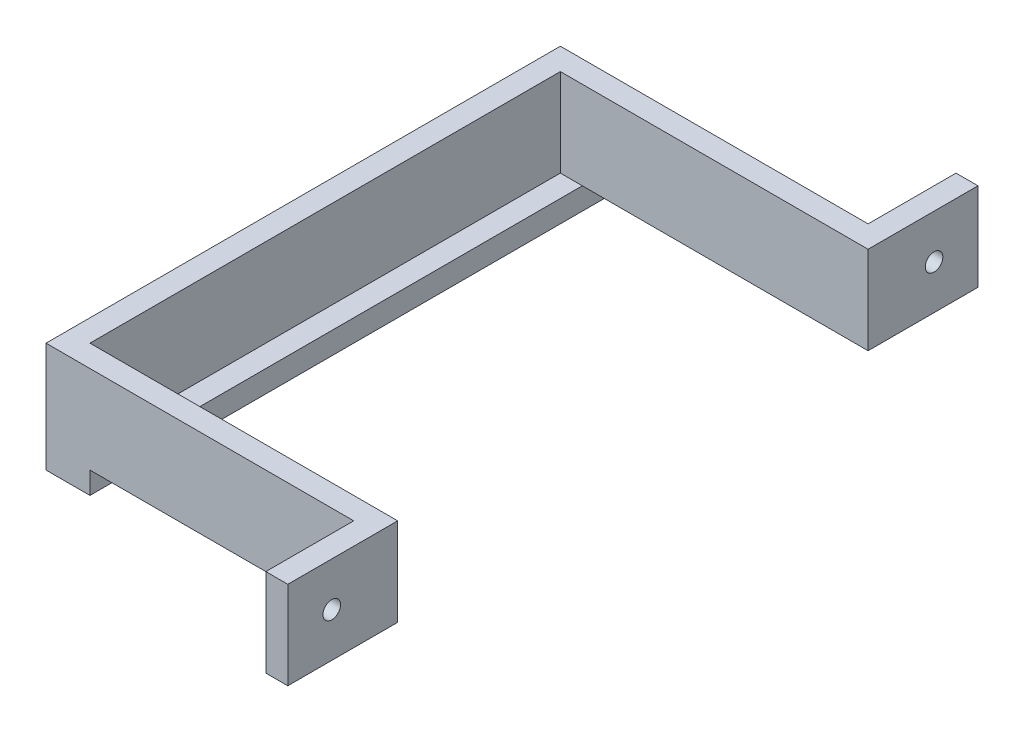
ISO-10303-21;
HEADER;
FILE_DESCRIPTION(('STEP AP214'),'2;1');
FILE_NAME('part.step','',(''),(''),'','','');
FILE_SCHEMA(('AUTOMOTIVE_DESIGN { 1 0 10303 214 1 1 1 1 }'));
ENDSEC;
DATA;
#1=APPLICATION_CONTEXT('core data for automotive mechanical design processes');
#2=APPLICATION_PROTOCOL_DEFINITION('international standard','automotive_design',2000,#1);
#3=PRODUCT_CONTEXT('',#1,'mechanical');
#4=PRODUCT('Part','Part','',(#3));
#5=PRODUCT_RELATED_PRODUCT_CATEGORY('part','',(#4));
#6=PRODUCT_DEFINITION_FORMATION('','',#4);
#7=PRODUCT_DEFINITION_CONTEXT('part definition',#1,'design');
#8=PRODUCT_DEFINITION('design','',#6,#7);
#9=PRODUCT_DEFINITION_SHAPE('','',#8);
#10=(LENGTH_UNIT() NAMED_UNIT(*) SI_UNIT(.MILLI.,.METRE.));
#11=(NAMED_UNIT(*) PLANE_ANGLE_UNIT() SI_UNIT($,.RADIAN.));
#12=(NAMED_UNIT(*) SI_UNIT($,.STERADIAN.) SOLID_ANGLE_UNIT());
#13=UNCERTAINTY_MEASURE_WITH_UNIT(LENGTH_MEASURE(1.E-05),#10,'distance_accuracy_value','');
#14=(GEOMETRIC_REPRESENTATION_CONTEXT(3) GLOBAL_UNCERTAINTY_ASSIGNED_CONTEXT((#13)) GLOBAL_UNIT_ASSIGNED_CONTEXT((#10,
#11,#12)) REPRESENTATION_CONTEXT('',''));
#15=CARTESIAN_POINT('',(0.,0.,0.));
#16=DIRECTION('',(0.,0.,1.));
#17=DIRECTION('',(1.,0.,0.));
#18=AXIS2_PLACEMENT_3D('',#15,#16,#17);
#19=CARTESIAN_POINT('',(5.,10.,-58.5));
#20=DIRECTION('',(0.,0.,1.));
#21=DIRECTION('',(1.,0.,0.));
#22=AXIS2_PLACEMENT_3D('',#19,#20,#21);
#23=PLANE('',#22);
#24=DIRECTION('',(0.,1.,0.));
#25=VECTOR('',#24,1.);
#26=CARTESIAN_POINT('',(70.,10.,-58.5));
#27=LINE('',#26,#25);
#28=CARTESIAN_POINT('',(70.,-10.,-58.5));
#29=VERTEX_POINT('',#28);
#30=CARTESIAN_POINT('',(70.,10.,-58.5));
#31=VERTEX_POINT('',#30);
#32=EDGE_CURVE('E58',#29,#31,#27,.T.);
#33=ORIENTED_EDGE('',*,*,#32,.F.);
#34=DIRECTION('',(-1.,0.,0.));
#35=VECTOR('',#34,1.);
#36=CARTESIAN_POINT('',(5.,-10.,-58.5));
#37=LINE('',#36,#35);
#38=CARTESIAN_POINT('',(10.,-10.,-58.5));
#39=VERTEX_POINT('',#38);
#40=EDGE_CURVE('E256',#29,#39,#37,.T.);
#41=ORIENTED_EDGE('',*,*,#40,.T.);
#42=DIRECTION('',(0.,1.,0.));
#43=VECTOR('',#42,1.);
#44=CARTESIAN_POINT('',(10.,-15.,-58.5));
#45=LINE('',#44,#43);
#46=CARTESIAN_POINT('',(10.,-15.,-58.5));
#47=VERTEX_POINT('',#46);
#48=EDGE_CURVE('E220',#47,#39,#45,.T.);
#49=ORIENTED_EDGE('',*,*,#48,.F.);
#50=DIRECTION('',(1.,0.,0.));
#51=VECTOR('',#50,1.);
#52=CARTESIAN_POINT('',(0.,-15.,-58.5));
#53=LINE('',#52,#51);
#54=CARTESIAN_POINT('',(0.,-15.,-58.5));
#55=VERTEX_POINT('',#54);
#56=EDGE_CURVE('E209',#55,#47,#53,.T.);
#57=ORIENTED_EDGE('',*,*,#56,.F.);
#58=DIRECTION('',(0.,1.,0.));
#59=VECTOR('',#58,1.);
#60=CARTESIAN_POINT('',(0.,10.,-58.5));
#61=LINE('',#60,#59);
#62=CARTESIAN_POINT('',(0.,10.,-58.5));
#63=VERTEX_POINT('',#62);
#64=EDGE_CURVE('E250',#55,#63,#61,.T.);
#65=ORIENTED_EDGE('',*,*,#64,.T.);
#66=DIRECTION('',(-1.,0.,0.));
#67=VECTOR('',#66,1.);
#68=CARTESIAN_POINT('',(5.,10.,-58.5));
#69=LINE('',#68,#67);
#70=EDGE_CURVE('E44',#31,#63,#69,.T.);
#71=ORIENTED_EDGE('',*,*,#70,.F.);
#72=EDGE_LOOP('',(#33,#41,#49,#57,#65,#71));
#73=FACE_BOUND('',#72,.T.);
#74=ADVANCED_FACE('F41',(#73),#23,.F.);
#75=CARTESIAN_POINT('',(5.,10.,58.5));
#76=DIRECTION('',(0.,0.,-1.));
#77=DIRECTION('',(-1.,0.,0.));
#78=AXIS2_PLACEMENT_3D('',#75,#76,#77);
#79=PLANE('',#78);
#80=DIRECTION('',(0.,-1.,0.));
#81=VECTOR('',#80,1.);
#82=CARTESIAN_POINT('',(70.,10.,58.5));
#83=LINE('',#82,#81);
#84=CARTESIAN_POINT('',(70.,10.,58.5));
#85=VERTEX_POINT('',#84);
#86=CARTESIAN_POINT('',(70.,-10.,58.5));
#87=VERTEX_POINT('',#86);
#88=EDGE_CURVE('E66',#85,#87,#83,.T.);
#89=ORIENTED_EDGE('',*,*,#88,.F.);
#90=DIRECTION('',(-1.,0.,0.));
#91=VECTOR('',#90,1.);
#92=CARTESIAN_POINT('',(5.,10.,58.5));
#93=LINE('',#92,#91);
#94=CARTESIAN_POINT('',(0.,10.,58.5));
#95=VERTEX_POINT('',#94);
#96=EDGE_CURVE('E265',#85,#95,#93,.T.);
#97=ORIENTED_EDGE('',*,*,#96,.T.);
#98=DIRECTION('',(0.,-1.,0.));
#99=VECTOR('',#98,1.);
#100=CARTESIAN_POINT('',(0.,10.,58.5));
#101=LINE('',#100,#99);
#102=CARTESIAN_POINT('',(0.,-15.,58.5));
#103=VERTEX_POINT('',#102);
#104=EDGE_CURVE('E254',#95,#103,#101,.T.);
#105=ORIENTED_EDGE('',*,*,#104,.T.);
#106=DIRECTION('',(-1.,0.,0.));
#107=VECTOR('',#106,1.);
#108=CARTESIAN_POINT('',(0.,-15.,58.5));
#109=LINE('',#108,#107);
#110=CARTESIAN_POINT('',(10.,-15.,58.5));
#111=VERTEX_POINT('',#110);
#112=EDGE_CURVE('E213',#111,#103,#109,.T.);
#113=ORIENTED_EDGE('',*,*,#112,.F.);
#114=DIRECTION('',(0.,1.,0.));
#115=VECTOR('',#114,1.);
#116=CARTESIAN_POINT('',(10.,-15.,58.5));
#117=LINE('',#116,#115);
#118=CARTESIAN_POINT('',(10.,-10.,58.5));
#119=VERTEX_POINT('',#118);
#120=EDGE_CURVE('E215',#111,#119,#117,.T.);
#121=ORIENTED_EDGE('',*,*,#120,.T.);
#122=DIRECTION('',(-1.,0.,0.));
#123=VECTOR('',#122,1.);
#124=CARTESIAN_POINT('',(5.,-10.,58.5));
#125=LINE('',#124,#123);
#126=EDGE_CURVE('E264',#87,#119,#125,.T.);
#127=ORIENTED_EDGE('',*,*,#126,.F.);
#128=EDGE_LOOP('',(#89,#97,#105,#113,#121,#127));
#129=FACE_BOUND('',#128,.T.);
#130=ADVANCED_FACE('F281',(#129),#79,.F.);
#131=CARTESIAN_POINT('',(5.,-10.,58.5));
#132=DIRECTION('',(0.,1.,0.));
#133=DIRECTION('',(0.,0.,1.));
#134=AXIS2_PLACEMENT_3D('',#131,#132,#133);
#135=PLANE('',#134);
#136=DIRECTION('',(0.,0.,1.));
#137=VECTOR('',#136,1.);
#138=CARTESIAN_POINT('',(10.,-10.,58.5));
#139=LINE('',#138,#137);
#140=CARTESIAN_POINT('',(10.,-10.,-53.5));
#141=VERTEX_POINT('',#140);
#142=EDGE_CURVE('E50',#39,#141,#139,.T.);
#143=ORIENTED_EDGE('',*,*,#142,.F.);
#144=ORIENTED_EDGE('',*,*,#40,.F.);
#145=DIRECTION('',(0.,0.,1.));
#146=VECTOR('',#145,1.);
#147=CARTESIAN_POINT('',(70.,-10.,-78.5));
#148=LINE('',#147,#146);
#149=CARTESIAN_POINT('',(70.,-10.,-78.5));
#150=VERTEX_POINT('',#149);
#151=EDGE_CURVE('E167',#150,#29,#148,.T.);
#152=ORIENTED_EDGE('',*,*,#151,.F.);
#153=DIRECTION('',(-1.,0.,0.));
#154=VECTOR('',#153,1.);
#155=CARTESIAN_POINT('',(75.,-10.,-78.5));
#156=LINE('',#155,#154);
#157=CARTESIAN_POINT('',(75.,-10.,-78.5));
#158=VERTEX_POINT('',#157);
#159=EDGE_CURVE('E163',#158,#150,#156,.T.);
#160=ORIENTED_EDGE('',*,*,#159,.F.);
#161=DIRECTION('',(0.,0.,-1.));
#162=VECTOR('',#161,1.);
#163=CARTESIAN_POINT('',(75.,-10.,-58.5));
#164=LINE('',#163,#162);
#165=CARTESIAN_POINT('',(75.,-10.,-53.5));
#166=VERTEX_POINT('',#165);
#167=EDGE_CURVE('E150',#166,#158,#164,.T.);
#168=ORIENTED_EDGE('',*,*,#167,.F.);
#169=DIRECTION('',(-1.,0.,0.));
#170=VECTOR('',#169,1.);
#171=CARTESIAN_POINT('',(75.,-10.,-53.5));
#172=LINE('',#171,#170);
#173=EDGE_CURVE('E160',#166,#141,#172,.T.);
#174=ORIENTED_EDGE('',*,*,#173,.T.);
#175=EDGE_LOOP('',(#143,#144,#152,#160,#168,#174));
#176=FACE_BOUND('',#175,.T.);
#177=ADVANCED_FACE('F165',(#176),#135,.F.);
#178=CARTESIAN_POINT('',(10.,-10.,53.5));
#179=VERTEX_POINT('',#178);
#180=EDGE_CURVE('E11',#179,#119,#139,.T.);
#181=ORIENTED_EDGE('',*,*,#180,.F.);
#182=DIRECTION('',(-1.,0.,0.));
#183=VECTOR('',#182,1.);
#184=CARTESIAN_POINT('',(75.,-10.,53.5));
#185=LINE('',#184,#183);
#186=CARTESIAN_POINT('',(75.,-10.,53.5));
#187=VERTEX_POINT('',#186);
#188=EDGE_CURVE('E247',#187,#179,#185,.T.);
#189=ORIENTED_EDGE('',*,*,#188,.F.);
#190=DIRECTION('',(0.,0.,-1.));
#191=VECTOR('',#190,1.);
#192=CARTESIAN_POINT('',(75.,-10.,58.5));
#193=LINE('',#192,#191);
#194=CARTESIAN_POINT('',(75.,-10.,78.5));
#195=VERTEX_POINT('',#194);
#196=EDGE_CURVE('E235',#195,#187,#193,.T.);
#197=ORIENTED_EDGE('',*,*,#196,.F.);
#198=DIRECTION('',(1.,0.,0.));
#199=VECTOR('',#198,1.);
#200=CARTESIAN_POINT('',(75.,-10.,78.5));
#201=LINE('',#200,#199);
#202=CARTESIAN_POINT('',(70.,-10.,78.5));
#203=VERTEX_POINT('',#202);
#204=EDGE_CURVE('E196',#203,#195,#201,.T.);
#205=ORIENTED_EDGE('',*,*,#204,.F.);
#206=DIRECTION('',(0.,0.,-1.));
#207=VECTOR('',#206,1.);
#208=CARTESIAN_POINT('',(70.,-10.,78.5));
#209=LINE('',#208,#207);
#210=EDGE_CURVE('E199',#203,#87,#209,.T.);
#211=ORIENTED_EDGE('',*,*,#210,.T.);
#212=ORIENTED_EDGE('',*,*,#126,.T.);
#213=EDGE_LOOP('',(#181,#189,#197,#205,#211,#212));
#214=FACE_BOUND('',#213,.T.);
#215=ADVANCED_FACE('F288',(#214),#135,.F.);
#216=CARTESIAN_POINT('',(5.,0.,0.));
#217=DIRECTION('',(1.,0.,0.));
#218=DIRECTION('',(0.,0.,-1.));
#219=AXIS2_PLACEMENT_3D('',#216,#217,#218);
#220=PLANE('',#219);
#221=DIRECTION('',(0.,0.,-1.));
#222=VECTOR('',#221,1.);
#223=CARTESIAN_POINT('',(5.,-10.,58.5));
#224=LINE('',#223,#222);
#225=CARTESIAN_POINT('',(5.,-10.,53.5));
#226=VERTEX_POINT('',#225);
#227=CARTESIAN_POINT('',(5.,-10.,-53.5));
#228=VERTEX_POINT('',#227);
#229=EDGE_CURVE('E253',#226,#228,#224,.T.);
#230=ORIENTED_EDGE('',*,*,#229,.T.);
#231=DIRECTION('',(0.,-1.,0.));
#232=VECTOR('',#231,1.);
#233=CARTESIAN_POINT('',(5.,10.,-53.5));
#234=LINE('',#233,#232);
#235=CARTESIAN_POINT('',(5.,10.,-53.5));
#236=VERTEX_POINT('',#235);
#237=EDGE_CURVE('E228',#236,#228,#234,.T.);
#238=ORIENTED_EDGE('',*,*,#237,.F.);
#239=DIRECTION('',(0.,0.,1.));
#240=VECTOR('',#239,1.);
#241=CARTESIAN_POINT('',(5.,10.,58.5));
#242=LINE('',#241,#240);
#243=CARTESIAN_POINT('',(5.,10.,53.5));
#244=VERTEX_POINT('',#243);
#245=EDGE_CURVE('E251',#236,#244,#242,.T.);
#246=ORIENTED_EDGE('',*,*,#245,.T.);
#247=DIRECTION('',(0.,1.,0.));
#248=VECTOR('',#247,1.);
#249=CARTESIAN_POINT('',(5.,10.,53.5));
#250=LINE('',#249,#248);
#251=EDGE_CURVE('E230',#226,#244,#250,.T.);
#252=ORIENTED_EDGE('',*,*,#251,.F.);
#253=EDGE_LOOP('',(#230,#238,#246,#252));
#254=FACE_BOUND('',#253,.T.);
#255=ADVANCED_FACE('F300',(#254),#220,.T.);
#256=CARTESIAN_POINT('',(5.,10.,58.5));
#257=DIRECTION('',(0.,-1.,0.));
#258=DIRECTION('',(0.,0.,-1.));
#259=AXIS2_PLACEMENT_3D('',#256,#257,#258);
#260=PLANE('',#259);
#261=DIRECTION('',(0.,0.,1.));
#262=VECTOR('',#261,1.);
#263=CARTESIAN_POINT('',(0.,10.,58.5));
#264=LINE('',#263,#262);
#265=EDGE_CURVE('E259',#63,#95,#264,.T.);
#266=ORIENTED_EDGE('',*,*,#265,.T.);
#267=ORIENTED_EDGE('',*,*,#96,.F.);
#268=DIRECTION('',(0.,0.,-1.));
#269=VECTOR('',#268,1.);
#270=CARTESIAN_POINT('',(70.,10.,78.5));
#271=LINE('',#270,#269);
#272=CARTESIAN_POINT('',(70.,10.,78.5));
#273=VERTEX_POINT('',#272);
#274=EDGE_CURVE('E203',#273,#85,#271,.T.);
#275=ORIENTED_EDGE('',*,*,#274,.F.);
#276=DIRECTION('',(-1.,0.,0.));
#277=VECTOR('',#276,1.);
#278=CARTESIAN_POINT('',(75.,10.,78.5));
#279=LINE('',#278,#277);
#280=CARTESIAN_POINT('',(75.,10.,78.5));
#281=VERTEX_POINT('',#280);
#282=EDGE_CURVE('E192',#281,#273,#279,.T.);
#283=ORIENTED_EDGE('',*,*,#282,.F.);
#284=DIRECTION('',(0.,0.,1.));
#285=VECTOR('',#284,1.);
#286=CARTESIAN_POINT('',(75.,10.,58.5));
#287=LINE('',#286,#285);
#288=CARTESIAN_POINT('',(75.,10.,53.5));
#289=VERTEX_POINT('',#288);
#290=EDGE_CURVE('E239',#289,#281,#287,.T.);
#291=ORIENTED_EDGE('',*,*,#290,.F.);
#292=DIRECTION('',(-1.,0.,0.));
#293=VECTOR('',#292,1.);
#294=CARTESIAN_POINT('',(75.,10.,53.5));
#295=LINE('',#294,#293);
#296=EDGE_CURVE('E241',#289,#244,#295,.T.);
#297=ORIENTED_EDGE('',*,*,#296,.T.);
#298=ORIENTED_EDGE('',*,*,#245,.F.);
#299=DIRECTION('',(-1.,0.,0.));
#300=VECTOR('',#299,1.);
#301=CARTESIAN_POINT('',(75.,10.,-53.5));
#302=LINE('',#301,#300);
#303=CARTESIAN_POINT('',(75.,10.,-53.5));
#304=VERTEX_POINT('',#303);
#305=EDGE_CURVE('E223',#304,#236,#302,.T.);
#306=ORIENTED_EDGE('',*,*,#305,.F.);
#307=DIRECTION('',(0.,0.,1.));
#308=VECTOR('',#307,1.);
#309=CARTESIAN_POINT('',(75.,10.,-58.5));
#310=LINE('',#309,#308);
#311=CARTESIAN_POINT('',(75.,10.,-78.5));
#312=VERTEX_POINT('',#311);
#313=EDGE_CURVE('E231',#312,#304,#310,.T.);
#314=ORIENTED_EDGE('',*,*,#313,.F.);
#315=DIRECTION('',(1.,0.,0.));
#316=VECTOR('',#315,1.);
#317=CARTESIAN_POINT('',(75.,10.,-78.5));
#318=LINE('',#317,#316);
#319=CARTESIAN_POINT('',(70.,10.,-78.5));
#320=VERTEX_POINT('',#319);
#321=EDGE_CURVE('E175',#320,#312,#318,.T.);
#322=ORIENTED_EDGE('',*,*,#321,.F.);
#323=DIRECTION('',(0.,0.,1.));
#324=VECTOR('',#323,1.);
#325=CARTESIAN_POINT('',(70.,10.,-78.5));
#326=LINE('',#325,#324);
#327=EDGE_CURVE('E184',#320,#31,#326,.T.);
#328=ORIENTED_EDGE('',*,*,#327,.T.);
#329=ORIENTED_EDGE('',*,*,#70,.T.);
#330=EDGE_LOOP('',(#266,#267,#275,#283,#291,#297,#298,#306,#314,#322,#328,#329));
#331=FACE_BOUND('',#330,.T.);
#332=ADVANCED_FACE('F268',(#331),#260,.F.);
#333=CARTESIAN_POINT('',(0.,0.,0.));
#334=DIRECTION('',(1.,0.,0.));
#335=DIRECTION('',(0.,0.,-1.));
#336=AXIS2_PLACEMENT_3D('',#333,#334,#335);
#337=PLANE('',#336);
#338=ORIENTED_EDGE('',*,*,#64,.F.);
#339=DIRECTION('',(0.,0.,-1.));
#340=VECTOR('',#339,1.);
#341=CARTESIAN_POINT('',(0.,-15.,58.5));
#342=LINE('',#341,#340);
#343=EDGE_CURVE('E206',#103,#55,#342,.T.);
#344=ORIENTED_EDGE('',*,*,#343,.F.);
#345=ORIENTED_EDGE('',*,*,#104,.F.);
#346=ORIENTED_EDGE('',*,*,#265,.F.);
#347=EDGE_LOOP('',(#338,#344,#345,#346));
#348=FACE_BOUND('',#347,.T.);
#349=ADVANCED_FACE('F272',(#348),#337,.F.);
#350=CARTESIAN_POINT('',(75.,10.,53.5));
#351=DIRECTION('',(0.,0.,1.));
#352=DIRECTION('',(1.,0.,0.));
#353=AXIS2_PLACEMENT_3D('',#350,#351,#352);
#354=PLANE('',#353);
#355=ORIENTED_EDGE('',*,*,#251,.T.);
#356=ORIENTED_EDGE('',*,*,#296,.F.);
#357=DIRECTION('',(0.,1.,0.));
#358=VECTOR('',#357,1.);
#359=CARTESIAN_POINT('',(75.,10.,53.5));
#360=LINE('',#359,#358);
#361=EDGE_CURVE('E237',#187,#289,#360,.T.);
#362=ORIENTED_EDGE('',*,*,#361,.F.);
#363=ORIENTED_EDGE('',*,*,#188,.T.);
#364=EDGE_CURVE('E246',#179,#226,#185,.T.);
#365=ORIENTED_EDGE('',*,*,#364,.T.);
#366=EDGE_LOOP('',(#355,#356,#362,#363,#365));
#367=FACE_BOUND('',#366,.T.);
#368=ADVANCED_FACE('F292',(#367),#354,.F.);
#369=CARTESIAN_POINT('',(75.,0.,0.));
#370=DIRECTION('',(1.,0.,0.));
#371=DIRECTION('',(0.,0.,-1.));
#372=AXIS2_PLACEMENT_3D('',#369,#370,#371);
#373=PLANE('',#372);
#374=CARTESIAN_POINT('',(75.,0.,68.5));
#375=DIRECTION('',(-1.,0.,0.));
#376=DIRECTION('',(0.,0.,1.));
#377=AXIS2_PLACEMENT_3D('',#374,#375,#376);
#378=CIRCLE('',#377,2.);
#379=CARTESIAN_POINT('',(75.,0.,70.5));
#380=VERTEX_POINT('',#379);
#381=EDGE_CURVE('E180',#380,#380,#378,.T.);
#382=ORIENTED_EDGE('',*,*,#381,.T.);
#383=EDGE_LOOP('',(#382));
#384=FACE_BOUND('',#383,.T.);
#385=ORIENTED_EDGE('',*,*,#290,.T.);
#386=DIRECTION('',(0.,1.,0.));
#387=VECTOR('',#386,1.);
#388=CARTESIAN_POINT('',(75.,10.,78.5));
#389=LINE('',#388,#387);
#390=EDGE_CURVE('E189',#195,#281,#389,.T.);
#391=ORIENTED_EDGE('',*,*,#390,.F.);
#392=ORIENTED_EDGE('',*,*,#196,.T.);
#393=ORIENTED_EDGE('',*,*,#361,.T.);
#394=EDGE_LOOP('',(#385,#391,#392,#393));
#395=FACE_BOUND('',#394,.T.);
#396=ADVANCED_FACE('F310',(#384,#395),#373,.T.);
#397=CARTESIAN_POINT('',(75.,10.,-53.5));
#398=DIRECTION('',(0.,0.,-1.));
#399=DIRECTION('',(0.,1.,0.));
#400=AXIS2_PLACEMENT_3D('',#397,#398,#399);
#401=PLANE('',#400);
#402=ORIENTED_EDGE('',*,*,#237,.T.);
#403=EDGE_CURVE('E226',#141,#228,#172,.T.);
#404=ORIENTED_EDGE('',*,*,#403,.F.);
#405=ORIENTED_EDGE('',*,*,#173,.F.);
#406=DIRECTION('',(0.,-1.,0.));
#407=VECTOR('',#406,1.);
#408=CARTESIAN_POINT('',(75.,10.,-53.5));
#409=LINE('',#408,#407);
#410=EDGE_CURVE('E156',#304,#166,#409,.T.);
#411=ORIENTED_EDGE('',*,*,#410,.F.);
#412=ORIENTED_EDGE('',*,*,#305,.T.);
#413=EDGE_LOOP('',(#402,#404,#405,#411,#412));
#414=FACE_BOUND('',#413,.T.);
#415=ADVANCED_FACE('F303',(#414),#401,.F.);
#416=CARTESIAN_POINT('',(75.,0.,0.));
#417=DIRECTION('',(-1.,0.,0.));
#418=DIRECTION('',(0.,0.,1.));
#419=AXIS2_PLACEMENT_3D('',#416,#417,#418);
#420=PLANE('',#419);
#421=CARTESIAN_POINT('',(75.,0.,-68.5));
#422=DIRECTION('',(-1.,0.,0.));
#423=DIRECTION('',(0.,0.,1.));
#424=AXIS2_PLACEMENT_3D('',#421,#422,#423);
#425=CIRCLE('',#424,2.);
#426=CARTESIAN_POINT('',(75.,0.,-66.5));
#427=VERTEX_POINT('',#426);
#428=EDGE_CURVE('E177',#427,#427,#425,.T.);
#429=ORIENTED_EDGE('',*,*,#428,.T.);
#430=EDGE_LOOP('',(#429));
#431=FACE_BOUND('',#430,.T.);
#432=ORIENTED_EDGE('',*,*,#167,.T.);
#433=DIRECTION('',(0.,-1.,0.));
#434=VECTOR('',#433,1.);
#435=CARTESIAN_POINT('',(75.,10.,-78.5));
#436=LINE('',#435,#434);
#437=EDGE_CURVE('E154',#312,#158,#436,.T.);
#438=ORIENTED_EDGE('',*,*,#437,.F.);
#439=ORIENTED_EDGE('',*,*,#313,.T.);
#440=ORIENTED_EDGE('',*,*,#410,.T.);
#441=EDGE_LOOP('',(#432,#438,#439,#440));
#442=FACE_BOUND('',#441,.T.);
#443=ADVANCED_FACE('F152',(#431,#442),#420,.F.);
#444=CARTESIAN_POINT('',(0.,-10.,0.));
#445=DIRECTION('',(0.,-1.,0.));
#446=DIRECTION('',(0.,0.,-1.));
#447=AXIS2_PLACEMENT_3D('',#444,#445,#446);
#448=PLANE('',#447);
#449=EDGE_CURVE('E51',#141,#179,#139,.T.);
#450=ORIENTED_EDGE('',*,*,#449,.F.);
#451=ORIENTED_EDGE('',*,*,#403,.T.);
#452=ORIENTED_EDGE('',*,*,#229,.F.);
#453=ORIENTED_EDGE('',*,*,#364,.F.);
#454=EDGE_LOOP('',(#450,#451,#452,#453));
#455=FACE_BOUND('',#454,.T.);
#456=ADVANCED_FACE('F297',(#455),#448,.F.);
#457=CARTESIAN_POINT('',(10.,-15.,58.5));
#458=DIRECTION('',(-1.,0.,0.));
#459=DIRECTION('',(0.,0.,1.));
#460=AXIS2_PLACEMENT_3D('',#457,#458,#459);
#461=PLANE('',#460);
#462=ORIENTED_EDGE('',*,*,#142,.T.);
#463=ORIENTED_EDGE('',*,*,#449,.T.);
#464=ORIENTED_EDGE('',*,*,#180,.T.);
#465=ORIENTED_EDGE('',*,*,#120,.F.);
#466=DIRECTION('',(0.,0.,1.));
#467=VECTOR('',#466,1.);
#468=CARTESIAN_POINT('',(10.,-15.,58.5));
#469=LINE('',#468,#467);
#470=EDGE_CURVE('E211',#47,#111,#469,.T.);
#471=ORIENTED_EDGE('',*,*,#470,.F.);
#472=ORIENTED_EDGE('',*,*,#48,.T.);
#473=EDGE_LOOP('',(#462,#463,#464,#465,#471,#472));
#474=FACE_BOUND('',#473,.T.);
#475=ADVANCED_FACE('F283',(#474),#461,.F.);
#476=CARTESIAN_POINT('',(0.,-15.,0.));
#477=DIRECTION('',(0.,-1.,0.));
#478=DIRECTION('',(0.,0.,-1.));
#479=AXIS2_PLACEMENT_3D('',#476,#477,#478);
#480=PLANE('',#479);
#481=ORIENTED_EDGE('',*,*,#343,.T.);
#482=ORIENTED_EDGE('',*,*,#56,.T.);
#483=ORIENTED_EDGE('',*,*,#470,.T.);
#484=ORIENTED_EDGE('',*,*,#112,.T.);
#485=EDGE_LOOP('',(#481,#482,#483,#484));
#486=FACE_BOUND('',#485,.T.);
#487=ADVANCED_FACE('F278',(#486),#480,.T.);
#488=CARTESIAN_POINT('',(70.,10.,78.5));
#489=DIRECTION('',(1.,0.,0.));
#490=DIRECTION('',(0.,0.,-1.));
#491=AXIS2_PLACEMENT_3D('',#488,#489,#490);
#492=PLANE('',#491);
#493=CARTESIAN_POINT('',(70.,0.,68.5));
#494=DIRECTION('',(-1.,0.,0.));
#495=DIRECTION('',(0.,0.,1.));
#496=AXIS2_PLACEMENT_3D('',#493,#494,#495);
#497=CIRCLE('',#496,2.);
#498=CARTESIAN_POINT('',(70.,0.,70.5));
#499=VERTEX_POINT('',#498);
#500=EDGE_CURVE('E531',#499,#499,#497,.T.);
#501=ORIENTED_EDGE('',*,*,#500,.F.);
#502=EDGE_LOOP('',(#501));
#503=FACE_BOUND('',#502,.T.);
#504=ORIENTED_EDGE('',*,*,#88,.T.);
#505=ORIENTED_EDGE('',*,*,#210,.F.);
#506=DIRECTION('',(0.,-1.,0.));
#507=VECTOR('',#506,1.);
#508=CARTESIAN_POINT('',(70.,10.,78.5));
#509=LINE('',#508,#507);
#510=EDGE_CURVE('E194',#273,#203,#509,.T.);
#511=ORIENTED_EDGE('',*,*,#510,.F.);
#512=ORIENTED_EDGE('',*,*,#274,.T.);
#513=EDGE_LOOP('',(#504,#505,#511,#512));
#514=FACE_BOUND('',#513,.T.);
#515=ADVANCED_FACE('F317',(#503,#514),#492,.F.);
#516=CARTESIAN_POINT('',(0.,0.,78.5));
#517=DIRECTION('',(0.,0.,-1.));
#518=DIRECTION('',(-1.,0.,0.));
#519=AXIS2_PLACEMENT_3D('',#516,#517,#518);
#520=PLANE('',#519);
#521=ORIENTED_EDGE('',*,*,#390,.T.);
#522=ORIENTED_EDGE('',*,*,#282,.T.);
#523=ORIENTED_EDGE('',*,*,#510,.T.);
#524=ORIENTED_EDGE('',*,*,#204,.T.);
#525=EDGE_LOOP('',(#521,#522,#523,#524));
#526=FACE_BOUND('',#525,.T.);
#527=ADVANCED_FACE('F313',(#526),#520,.F.);
#528=CARTESIAN_POINT('',(70.,10.,-78.5));
#529=DIRECTION('',(1.,0.,0.));
#530=DIRECTION('',(0.,0.,-1.));
#531=AXIS2_PLACEMENT_3D('',#528,#529,#530);
#532=PLANE('',#531);
#533=CARTESIAN_POINT('',(70.,0.,-68.5));
#534=DIRECTION('',(-1.,0.,0.));
#535=DIRECTION('',(0.,0.,1.));
#536=AXIS2_PLACEMENT_3D('',#533,#534,#535);
#537=CIRCLE('',#536,2.);
#538=CARTESIAN_POINT('',(70.,0.,-66.5));
#539=VERTEX_POINT('',#538);
#540=EDGE_CURVE('E532',#539,#539,#537,.T.);
#541=ORIENTED_EDGE('',*,*,#540,.F.);
#542=EDGE_LOOP('',(#541));
#543=FACE_BOUND('',#542,.T.);
#544=ORIENTED_EDGE('',*,*,#32,.T.);
#545=ORIENTED_EDGE('',*,*,#327,.F.);
#546=DIRECTION('',(0.,1.,0.));
#547=VECTOR('',#546,1.);
#548=CARTESIAN_POINT('',(70.,10.,-78.5));
#549=LINE('',#548,#547);
#550=EDGE_CURVE('E170',#150,#320,#549,.T.);
#551=ORIENTED_EDGE('',*,*,#550,.F.);
#552=ORIENTED_EDGE('',*,*,#151,.T.);
#553=EDGE_LOOP('',(#544,#545,#551,#552));
#554=FACE_BOUND('',#553,.T.);
#555=ADVANCED_FACE('F326',(#543,#554),#532,.F.);
#556=CARTESIAN_POINT('',(0.,0.,-78.5));
#557=DIRECTION('',(0.,0.,-1.));
#558=DIRECTION('',(-1.,0.,0.));
#559=AXIS2_PLACEMENT_3D('',#556,#557,#558);
#560=PLANE('',#559);
#561=ORIENTED_EDGE('',*,*,#437,.T.);
#562=ORIENTED_EDGE('',*,*,#159,.T.);
#563=ORIENTED_EDGE('',*,*,#550,.T.);
#564=ORIENTED_EDGE('',*,*,#321,.T.);
#565=EDGE_LOOP('',(#561,#562,#563,#564));
#566=FACE_BOUND('',#565,.T.);
#567=ADVANCED_FACE('F173',(#566),#560,.T.);
#568=CARTESIAN_POINT('',(75.,0.,-68.5));
#569=DIRECTION('',(-1.,0.,0.));
#570=DIRECTION('',(0.,0.,1.));
#571=AXIS2_PLACEMENT_3D('',#568,#569,#570);
#572=CYLINDRICAL_SURFACE('',#571,2.);
#573=ORIENTED_EDGE('',*,*,#428,.F.);
#574=EDGE_LOOP('',(#573));
#575=FACE_BOUND('',#574,.T.);
#576=ORIENTED_EDGE('',*,*,#540,.T.);
#577=EDGE_LOOP('',(#576));
#578=FACE_BOUND('',#577,.T.);
#579=ADVANCED_FACE('F506',(#575,#578),#572,.F.);
#580=CARTESIAN_POINT('',(75.,0.,68.5));
#581=DIRECTION('',(-1.,0.,0.));
#582=DIRECTION('',(0.,0.,1.));
#583=AXIS2_PLACEMENT_3D('',#580,#581,#582);
#584=CYLINDRICAL_SURFACE('',#583,2.);
#585=ORIENTED_EDGE('',*,*,#381,.F.);
#586=EDGE_LOOP('',(#585));
#587=FACE_BOUND('',#586,.T.);
#588=ORIENTED_EDGE('',*,*,#500,.T.);
#589=EDGE_LOOP('',(#588));
#590=FACE_BOUND('',#589,.T.);
#591=ADVANCED_FACE('F514',(#587,#590),#584,.F.);
#592=CLOSED_SHELL('',(#74,#130,#177,#215,#255,#332,#349,#368,#396,#415,#443,#456,#475,#487,#515,
#527,#555,#567,#579,#591));
#593=MANIFOLD_SOLID_BREP('B2',#592);
#594=ADVANCED_BREP_SHAPE_REPRESENTATION('',(#18,#593),#14);
#595=SHAPE_DEFINITION_REPRESENTATION(#9,#594);
ENDSEC;
END-ISO-10303-21;
